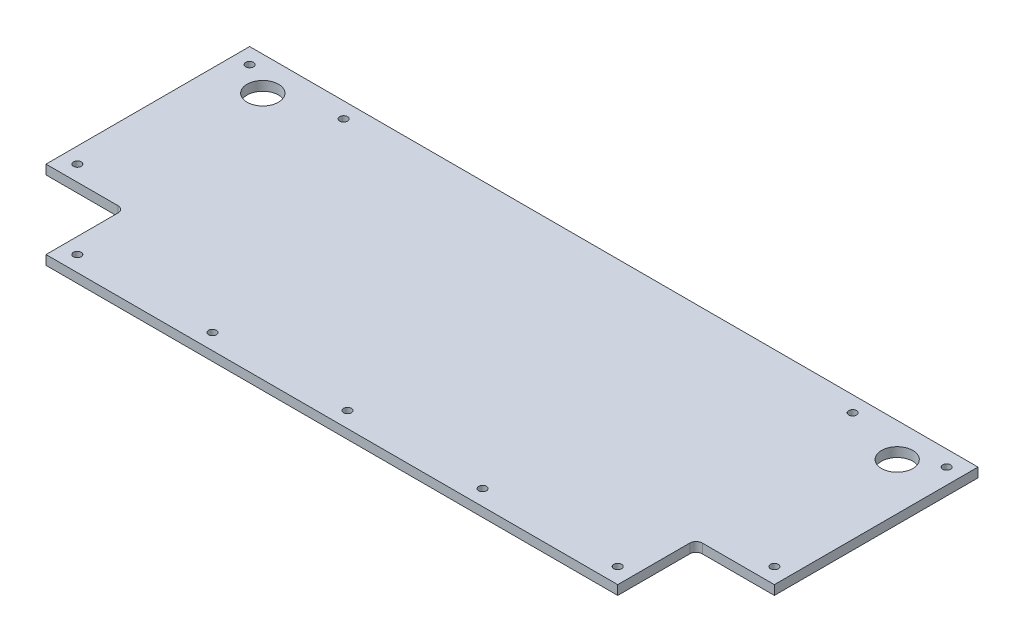
ISO-10303-21;
HEADER;
FILE_DESCRIPTION(('STEP AP214'),'2;1');
FILE_NAME('part.step','',(''),(''),'','','');
FILE_SCHEMA(('AUTOMOTIVE_DESIGN { 1 0 10303 214 1 1 1 1 }'));
ENDSEC;
DATA;
#1=APPLICATION_CONTEXT('core data for automotive mechanical design processes');
#2=APPLICATION_PROTOCOL_DEFINITION('international standard','automotive_design',2000,#1);
#3=PRODUCT_CONTEXT('',#1,'mechanical');
#4=PRODUCT('Part','Part','',(#3));
#5=PRODUCT_RELATED_PRODUCT_CATEGORY('part','',(#4));
#6=PRODUCT_DEFINITION_FORMATION('','',#4);
#7=PRODUCT_DEFINITION_CONTEXT('part definition',#1,'design');
#8=PRODUCT_DEFINITION('design','',#6,#7);
#9=PRODUCT_DEFINITION_SHAPE('','',#8);
#10=(LENGTH_UNIT() NAMED_UNIT(*) SI_UNIT(.MILLI.,.METRE.));
#11=(NAMED_UNIT(*) PLANE_ANGLE_UNIT() SI_UNIT($,.RADIAN.));
#12=(NAMED_UNIT(*) SI_UNIT($,.STERADIAN.) SOLID_ANGLE_UNIT());
#13=UNCERTAINTY_MEASURE_WITH_UNIT(LENGTH_MEASURE(1.E-05),#10,'distance_accuracy_value','');
#14=(GEOMETRIC_REPRESENTATION_CONTEXT(3) GLOBAL_UNCERTAINTY_ASSIGNED_CONTEXT((#13)) GLOBAL_UNIT_ASSIGNED_CONTEXT((#10,
#11,#12)) REPRESENTATION_CONTEXT('',''));
#15=CARTESIAN_POINT('',(0.,0.,0.));
#16=DIRECTION('',(0.,0.,1.));
#17=DIRECTION('',(1.,0.,0.));
#18=AXIS2_PLACEMENT_3D('',#15,#16,#17);
#19=CARTESIAN_POINT('',(182.5,6.,-50.));
#20=DIRECTION('',(-1.,0.,0.));
#21=DIRECTION('',(0.,0.,1.));
#22=AXIS2_PLACEMENT_3D('',#19,#20,#21);
#23=PLANE('',#22);
#24=DIRECTION('',(0.,0.,-1.));
#25=VECTOR('',#24,1.);
#26=CARTESIAN_POINT('',(182.5,0.,-50.));
#27=LINE('',#26,#25);
#28=CARTESIAN_POINT('',(182.5,0.,0.));
#29=VERTEX_POINT('',#28);
#30=CARTESIAN_POINT('',(182.5,0.,-46.));
#31=VERTEX_POINT('',#30);
#32=EDGE_CURVE('E198',#29,#31,#27,.T.);
#33=ORIENTED_EDGE('',*,*,#32,.T.);
#34=DIRECTION('',(0.,-1.,0.));
#35=VECTOR('',#34,1.);
#36=CARTESIAN_POINT('',(182.5,6.,-46.));
#37=LINE('',#36,#35);
#38=CARTESIAN_POINT('',(182.5,6.,-46.));
#39=VERTEX_POINT('',#38);
#40=EDGE_CURVE('E48',#31,#39,#37,.F.);
#41=ORIENTED_EDGE('',*,*,#40,.T.);
#42=DIRECTION('',(0.,0.,-1.));
#43=VECTOR('',#42,1.);
#44=CARTESIAN_POINT('',(182.5,6.,-50.));
#45=LINE('',#44,#43);
#46=CARTESIAN_POINT('',(182.5,6.,0.));
#47=VERTEX_POINT('',#46);
#48=EDGE_CURVE('E107',#47,#39,#45,.T.);
#49=ORIENTED_EDGE('',*,*,#48,.F.);
#50=DIRECTION('',(0.,-1.,0.));
#51=VECTOR('',#50,1.);
#52=CARTESIAN_POINT('',(182.5,6.,0.));
#53=LINE('',#52,#51);
#54=EDGE_CURVE('E110',#47,#29,#53,.T.);
#55=ORIENTED_EDGE('',*,*,#54,.T.);
#56=EDGE_LOOP('',(#33,#41,#49,#55));
#57=FACE_BOUND('',#56,.T.);
#58=ADVANCED_FACE('F33',(#57),#23,.F.);
#59=CARTESIAN_POINT('',(232.5,6.,-50.));
#60=DIRECTION('',(0.,0.,-1.));
#61=DIRECTION('',(-1.,0.,0.));
#62=AXIS2_PLACEMENT_3D('',#59,#60,#61);
#63=PLANE('',#62);
#64=DIRECTION('',(1.,0.,0.));
#65=VECTOR('',#64,1.);
#66=CARTESIAN_POINT('',(232.5,6.,-50.));
#67=LINE('',#66,#65);
#68=CARTESIAN_POINT('',(186.5,6.,-50.));
#69=VERTEX_POINT('',#68);
#70=CARTESIAN_POINT('',(232.5,6.,-50.));
#71=VERTEX_POINT('',#70);
#72=EDGE_CURVE('E113',#69,#71,#67,.T.);
#73=ORIENTED_EDGE('',*,*,#72,.F.);
#74=DIRECTION('',(0.,-1.,0.));
#75=VECTOR('',#74,1.);
#76=CARTESIAN_POINT('',(186.5,0.,-50.));
#77=LINE('',#76,#75);
#78=CARTESIAN_POINT('',(186.5,0.,-50.));
#79=VERTEX_POINT('',#78);
#80=EDGE_CURVE('E139',#69,#79,#77,.T.);
#81=ORIENTED_EDGE('',*,*,#80,.T.);
#82=DIRECTION('',(1.,0.,0.));
#83=VECTOR('',#82,1.);
#84=CARTESIAN_POINT('',(232.5,0.,-50.));
#85=LINE('',#84,#83);
#86=CARTESIAN_POINT('',(232.5,0.,-50.));
#87=VERTEX_POINT('',#86);
#88=EDGE_CURVE('E194',#79,#87,#85,.T.);
#89=ORIENTED_EDGE('',*,*,#88,.T.);
#90=DIRECTION('',(0.,-1.,0.));
#91=VECTOR('',#90,1.);
#92=CARTESIAN_POINT('',(232.5,6.,-50.));
#93=LINE('',#92,#91);
#94=EDGE_CURVE('E128',#71,#87,#93,.T.);
#95=ORIENTED_EDGE('',*,*,#94,.F.);
#96=EDGE_LOOP('',(#73,#81,#89,#95));
#97=FACE_BOUND('',#96,.T.);
#98=ADVANCED_FACE('F338',(#97),#63,.F.);
#99=CARTESIAN_POINT('',(232.5,6.,-180.));
#100=DIRECTION('',(-1.,0.,0.));
#101=DIRECTION('',(0.,0.,1.));
#102=AXIS2_PLACEMENT_3D('',#99,#100,#101);
#103=PLANE('',#102);
#104=DIRECTION('',(0.,0.,-1.));
#105=VECTOR('',#104,1.);
#106=CARTESIAN_POINT('',(232.5,0.,-180.));
#107=LINE('',#106,#105);
#108=CARTESIAN_POINT('',(232.5,0.,-180.));
#109=VERTEX_POINT('',#108);
#110=EDGE_CURVE('E193',#87,#109,#107,.T.);
#111=ORIENTED_EDGE('',*,*,#110,.T.);
#112=DIRECTION('',(0.,-1.,0.));
#113=VECTOR('',#112,1.);
#114=CARTESIAN_POINT('',(232.5,6.,-180.));
#115=LINE('',#114,#113);
#116=CARTESIAN_POINT('',(232.5,6.,-180.));
#117=VERTEX_POINT('',#116);
#118=EDGE_CURVE('E134',#117,#109,#115,.T.);
#119=ORIENTED_EDGE('',*,*,#118,.F.);
#120=DIRECTION('',(0.,0.,-1.));
#121=VECTOR('',#120,1.);
#122=CARTESIAN_POINT('',(232.5,6.,-180.));
#123=LINE('',#122,#121);
#124=EDGE_CURVE('E205',#71,#117,#123,.T.);
#125=ORIENTED_EDGE('',*,*,#124,.F.);
#126=ORIENTED_EDGE('',*,*,#94,.T.);
#127=EDGE_LOOP('',(#111,#119,#125,#126));
#128=FACE_BOUND('',#127,.T.);
#129=ADVANCED_FACE('F343',(#128),#103,.F.);
#130=CARTESIAN_POINT('',(-232.5,6.,-180.));
#131=DIRECTION('',(0.,0.,1.));
#132=DIRECTION('',(1.,0.,0.));
#133=AXIS2_PLACEMENT_3D('',#130,#131,#132);
#134=PLANE('',#133);
#135=DIRECTION('',(-1.,0.,0.));
#136=VECTOR('',#135,1.);
#137=CARTESIAN_POINT('',(-232.5,0.,-180.));
#138=LINE('',#137,#136);
#139=CARTESIAN_POINT('',(-232.5,0.,-180.));
#140=VERTEX_POINT('',#139);
#141=EDGE_CURVE('E173',#109,#140,#138,.T.);
#142=ORIENTED_EDGE('',*,*,#141,.T.);
#143=DIRECTION('',(0.,-1.,0.));
#144=VECTOR('',#143,1.);
#145=CARTESIAN_POINT('',(-232.5,6.,-180.));
#146=LINE('',#145,#144);
#147=CARTESIAN_POINT('',(-232.5,6.,-180.));
#148=VERTEX_POINT('',#147);
#149=EDGE_CURVE('E180',#148,#140,#146,.T.);
#150=ORIENTED_EDGE('',*,*,#149,.F.);
#151=DIRECTION('',(-1.,0.,0.));
#152=VECTOR('',#151,1.);
#153=CARTESIAN_POINT('',(-232.5,6.,-180.));
#154=LINE('',#153,#152);
#155=EDGE_CURVE('E189',#117,#148,#154,.T.);
#156=ORIENTED_EDGE('',*,*,#155,.F.);
#157=ORIENTED_EDGE('',*,*,#118,.T.);
#158=EDGE_LOOP('',(#142,#150,#156,#157));
#159=FACE_BOUND('',#158,.T.);
#160=ADVANCED_FACE('F187',(#159),#134,.F.);
#161=CARTESIAN_POINT('',(-232.5,6.,-50.));
#162=DIRECTION('',(1.,0.,0.));
#163=DIRECTION('',(0.,0.,-1.));
#164=AXIS2_PLACEMENT_3D('',#161,#162,#163);
#165=PLANE('',#164);
#166=DIRECTION('',(0.,0.,1.));
#167=VECTOR('',#166,1.);
#168=CARTESIAN_POINT('',(-232.5,0.,-50.));
#169=LINE('',#168,#167);
#170=CARTESIAN_POINT('',(-232.5,0.,-50.));
#171=VERTEX_POINT('',#170);
#172=EDGE_CURVE('E170',#140,#171,#169,.T.);
#173=ORIENTED_EDGE('',*,*,#172,.T.);
#174=DIRECTION('',(0.,-1.,0.));
#175=VECTOR('',#174,1.);
#176=CARTESIAN_POINT('',(-232.5,6.,-50.));
#177=LINE('',#176,#175);
#178=CARTESIAN_POINT('',(-232.5,6.,-50.));
#179=VERTEX_POINT('',#178);
#180=EDGE_CURVE('E169',#179,#171,#177,.T.);
#181=ORIENTED_EDGE('',*,*,#180,.F.);
#182=DIRECTION('',(0.,0.,1.));
#183=VECTOR('',#182,1.);
#184=CARTESIAN_POINT('',(-232.5,6.,-50.));
#185=LINE('',#184,#183);
#186=EDGE_CURVE('E202',#148,#179,#185,.T.);
#187=ORIENTED_EDGE('',*,*,#186,.F.);
#188=ORIENTED_EDGE('',*,*,#149,.T.);
#189=EDGE_LOOP('',(#173,#181,#187,#188));
#190=FACE_BOUND('',#189,.T.);
#191=ADVANCED_FACE('F457',(#190),#165,.F.);
#192=CARTESIAN_POINT('',(-182.5,6.,-50.));
#193=DIRECTION('',(0.,0.,-1.));
#194=DIRECTION('',(-1.,0.,0.));
#195=AXIS2_PLACEMENT_3D('',#192,#193,#194);
#196=PLANE('',#195);
#197=DIRECTION('',(1.,0.,0.));
#198=VECTOR('',#197,1.);
#199=CARTESIAN_POINT('',(-182.5,0.,-50.));
#200=LINE('',#199,#198);
#201=CARTESIAN_POINT('',(-186.5,0.,-50.));
#202=VERTEX_POINT('',#201);
#203=EDGE_CURVE('E163',#171,#202,#200,.T.);
#204=ORIENTED_EDGE('',*,*,#203,.T.);
#205=DIRECTION('',(0.,-1.,0.));
#206=VECTOR('',#205,1.);
#207=CARTESIAN_POINT('',(-186.5,6.,-50.));
#208=LINE('',#207,#206);
#209=CARTESIAN_POINT('',(-186.5,6.,-50.));
#210=VERTEX_POINT('',#209);
#211=EDGE_CURVE('E131',#202,#210,#208,.F.);
#212=ORIENTED_EDGE('',*,*,#211,.T.);
#213=DIRECTION('',(1.,0.,0.));
#214=VECTOR('',#213,1.);
#215=CARTESIAN_POINT('',(-182.5,6.,-50.));
#216=LINE('',#215,#214);
#217=EDGE_CURVE('E149',#179,#210,#216,.T.);
#218=ORIENTED_EDGE('',*,*,#217,.F.);
#219=ORIENTED_EDGE('',*,*,#180,.T.);
#220=EDGE_LOOP('',(#204,#212,#218,#219));
#221=FACE_BOUND('',#220,.T.);
#222=ADVANCED_FACE('F167',(#221),#196,.F.);
#223=CARTESIAN_POINT('',(-182.5,6.,0.));
#224=DIRECTION('',(1.,0.,0.));
#225=DIRECTION('',(0.,0.,-1.));
#226=AXIS2_PLACEMENT_3D('',#223,#224,#225);
#227=PLANE('',#226);
#228=DIRECTION('',(0.,0.,1.));
#229=VECTOR('',#228,1.);
#230=CARTESIAN_POINT('',(-182.5,6.,0.));
#231=LINE('',#230,#229);
#232=CARTESIAN_POINT('',(-182.5,6.,-46.));
#233=VERTEX_POINT('',#232);
#234=CARTESIAN_POINT('',(-182.5,6.,0.));
#235=VERTEX_POINT('',#234);
#236=EDGE_CURVE('E119',#233,#235,#231,.T.);
#237=ORIENTED_EDGE('',*,*,#236,.F.);
#238=DIRECTION('',(0.,-1.,0.));
#239=VECTOR('',#238,1.);
#240=CARTESIAN_POINT('',(-182.5,0.,-46.));
#241=LINE('',#240,#239);
#242=CARTESIAN_POINT('',(-182.5,0.,-46.));
#243=VERTEX_POINT('',#242);
#244=EDGE_CURVE('E127',#233,#243,#241,.T.);
#245=ORIENTED_EDGE('',*,*,#244,.T.);
#246=DIRECTION('',(0.,0.,1.));
#247=VECTOR('',#246,1.);
#248=CARTESIAN_POINT('',(-182.5,0.,0.));
#249=LINE('',#248,#247);
#250=CARTESIAN_POINT('',(-182.5,0.,0.));
#251=VERTEX_POINT('',#250);
#252=EDGE_CURVE('E164',#243,#251,#249,.T.);
#253=ORIENTED_EDGE('',*,*,#252,.T.);
#254=DIRECTION('',(0.,-1.,0.));
#255=VECTOR('',#254,1.);
#256=CARTESIAN_POINT('',(-182.5,6.,0.));
#257=LINE('',#256,#255);
#258=EDGE_CURVE('E156',#235,#251,#257,.T.);
#259=ORIENTED_EDGE('',*,*,#258,.F.);
#260=EDGE_LOOP('',(#237,#245,#253,#259));
#261=FACE_BOUND('',#260,.T.);
#262=ADVANCED_FACE('F154',(#261),#227,.F.);
#263=CARTESIAN_POINT('',(0.,6.,0.));
#264=DIRECTION('',(0.,0.,-1.));
#265=DIRECTION('',(-1.,0.,0.));
#266=AXIS2_PLACEMENT_3D('',#263,#264,#265);
#267=PLANE('',#266);
#268=DIRECTION('',(1.,0.,0.));
#269=VECTOR('',#268,1.);
#270=CARTESIAN_POINT('',(0.,0.,0.));
#271=LINE('',#270,#269);
#272=EDGE_CURVE('E123',#251,#29,#271,.T.);
#273=ORIENTED_EDGE('',*,*,#272,.T.);
#274=ORIENTED_EDGE('',*,*,#54,.F.);
#275=DIRECTION('',(1.,0.,0.));
#276=VECTOR('',#275,1.);
#277=CARTESIAN_POINT('',(182.5,6.,0.));
#278=LINE('',#277,#276);
#279=EDGE_CURVE('E114',#235,#47,#278,.T.);
#280=ORIENTED_EDGE('',*,*,#279,.F.);
#281=ORIENTED_EDGE('',*,*,#258,.T.);
#282=EDGE_LOOP('',(#273,#274,#280,#281));
#283=FACE_BOUND('',#282,.T.);
#284=ADVANCED_FACE('F125',(#283),#267,.F.);
#285=CARTESIAN_POINT('',(0.,6.,0.));
#286=DIRECTION('',(0.,-1.,0.));
#287=DIRECTION('',(0.,0.,-1.));
#288=AXIS2_PLACEMENT_3D('',#285,#286,#287);
#289=PLANE('',#288);
#290=CARTESIAN_POINT('',(202.5,6.,-158.4));
#291=DIRECTION('',(0.,1.,0.));
#292=DIRECTION('',(0.,0.,1.));
#293=AXIS2_PLACEMENT_3D('',#290,#291,#292);
#294=CIRCLE('',#293,10.);
#295=CARTESIAN_POINT('',(202.5,6.,-148.4));
#296=VERTEX_POINT('',#295);
#297=EDGE_CURVE('E280',#296,#296,#294,.T.);
#298=ORIENTED_EDGE('',*,*,#297,.F.);
#299=EDGE_LOOP('',(#298));
#300=FACE_BOUND('',#299,.T.);
#301=CARTESIAN_POINT('',(-202.5,6.,-158.4));
#302=DIRECTION('',(0.,1.,0.));
#303=DIRECTION('',(0.,0.,1.));
#304=AXIS2_PLACEMENT_3D('',#301,#302,#303);
#305=CIRCLE('',#304,10.);
#306=CARTESIAN_POINT('',(-202.5,6.,-148.4));
#307=VERTEX_POINT('',#306);
#308=EDGE_CURVE('E274',#307,#307,#305,.T.);
#309=ORIENTED_EDGE('',*,*,#308,.F.);
#310=EDGE_LOOP('',(#309));
#311=FACE_BOUND('',#310,.T.);
#312=CARTESIAN_POINT('',(162.5,6.,-170.));
#313=DIRECTION('',(0.,1.,0.));
#314=DIRECTION('',(0.,0.,1.));
#315=AXIS2_PLACEMENT_3D('',#312,#313,#314);
#316=CIRCLE('',#315,2.5);
#317=CARTESIAN_POINT('',(162.5,6.,-167.5));
#318=VERTEX_POINT('',#317);
#319=EDGE_CURVE('E268',#318,#318,#316,.T.);
#320=ORIENTED_EDGE('',*,*,#319,.F.);
#321=EDGE_LOOP('',(#320));
#322=FACE_BOUND('',#321,.T.);
#323=CARTESIAN_POINT('',(-162.5,6.,-170.));
#324=DIRECTION('',(0.,1.,0.));
#325=DIRECTION('',(0.,0.,1.));
#326=AXIS2_PLACEMENT_3D('',#323,#324,#325);
#327=CIRCLE('',#326,2.5);
#328=CARTESIAN_POINT('',(-162.5,6.,-167.5));
#329=VERTEX_POINT('',#328);
#330=EDGE_CURVE('E262',#329,#329,#327,.T.);
#331=ORIENTED_EDGE('',*,*,#330,.F.);
#332=EDGE_LOOP('',(#331));
#333=FACE_BOUND('',#332,.T.);
#334=CARTESIAN_POINT('',(172.5,6.,-9.99999999999998));
#335=DIRECTION('',(0.,1.,0.));
#336=DIRECTION('',(0.,0.,1.));
#337=AXIS2_PLACEMENT_3D('',#334,#335,#336);
#338=CIRCLE('',#337,2.5);
#339=CARTESIAN_POINT('',(172.5,6.,-7.49999999999998));
#340=VERTEX_POINT('',#339);
#341=EDGE_CURVE('E256',#340,#340,#338,.T.);
#342=ORIENTED_EDGE('',*,*,#341,.F.);
#343=EDGE_LOOP('',(#342));
#344=FACE_BOUND('',#343,.T.);
#345=CARTESIAN_POINT('',(86.25,6.,-9.99999999999998));
#346=DIRECTION('',(0.,1.,0.));
#347=DIRECTION('',(0.,0.,1.));
#348=AXIS2_PLACEMENT_3D('',#345,#346,#347);
#349=CIRCLE('',#348,2.49999999999999);
#350=CARTESIAN_POINT('',(86.25,6.,-7.49999999999998));
#351=VERTEX_POINT('',#350);
#352=EDGE_CURVE('E250',#351,#351,#349,.T.);
#353=ORIENTED_EDGE('',*,*,#352,.F.);
#354=EDGE_LOOP('',(#353));
#355=FACE_BOUND('',#354,.T.);
#356=CARTESIAN_POINT('',(0.,6.,-9.99999999999998));
#357=DIRECTION('',(0.,1.,0.));
#358=DIRECTION('',(0.,0.,1.));
#359=AXIS2_PLACEMENT_3D('',#356,#357,#358);
#360=CIRCLE('',#359,2.5);
#361=CARTESIAN_POINT('',(0.,6.,-7.49999999999998));
#362=VERTEX_POINT('',#361);
#363=EDGE_CURVE('E244',#362,#362,#360,.T.);
#364=ORIENTED_EDGE('',*,*,#363,.F.);
#365=EDGE_LOOP('',(#364));
#366=FACE_BOUND('',#365,.T.);
#367=CARTESIAN_POINT('',(-86.25,6.,-9.99999999999998));
#368=DIRECTION('',(0.,1.,0.));
#369=DIRECTION('',(0.,0.,1.));
#370=AXIS2_PLACEMENT_3D('',#367,#368,#369);
#371=CIRCLE('',#370,2.49999999999999);
#372=CARTESIAN_POINT('',(-86.25,6.,-7.49999999999998));
#373=VERTEX_POINT('',#372);
#374=EDGE_CURVE('E238',#373,#373,#371,.T.);
#375=ORIENTED_EDGE('',*,*,#374,.F.);
#376=EDGE_LOOP('',(#375));
#377=FACE_BOUND('',#376,.T.);
#378=CARTESIAN_POINT('',(-172.5,6.,-9.99999999999998));
#379=DIRECTION('',(0.,1.,0.));
#380=DIRECTION('',(0.,0.,1.));
#381=AXIS2_PLACEMENT_3D('',#378,#379,#380);
#382=CIRCLE('',#381,2.5);
#383=CARTESIAN_POINT('',(-172.5,6.,-7.49999999999998));
#384=VERTEX_POINT('',#383);
#385=EDGE_CURVE('E232',#384,#384,#382,.T.);
#386=ORIENTED_EDGE('',*,*,#385,.F.);
#387=EDGE_LOOP('',(#386));
#388=FACE_BOUND('',#387,.T.);
#389=CARTESIAN_POINT('',(222.5,6.,-60.));
#390=DIRECTION('',(0.,1.,0.));
#391=DIRECTION('',(0.,0.,1.));
#392=AXIS2_PLACEMENT_3D('',#389,#390,#391);
#393=CIRCLE('',#392,2.5);
#394=CARTESIAN_POINT('',(222.5,6.,-57.5));
#395=VERTEX_POINT('',#394);
#396=EDGE_CURVE('E226',#395,#395,#393,.T.);
#397=ORIENTED_EDGE('',*,*,#396,.F.);
#398=EDGE_LOOP('',(#397));
#399=FACE_BOUND('',#398,.T.);
#400=CARTESIAN_POINT('',(222.5,6.,-170.));
#401=DIRECTION('',(0.,1.,0.));
#402=DIRECTION('',(0.,0.,1.));
#403=AXIS2_PLACEMENT_3D('',#400,#401,#402);
#404=CIRCLE('',#403,2.5);
#405=CARTESIAN_POINT('',(222.5,6.,-167.5));
#406=VERTEX_POINT('',#405);
#407=EDGE_CURVE('E220',#406,#406,#404,.T.);
#408=ORIENTED_EDGE('',*,*,#407,.F.);
#409=EDGE_LOOP('',(#408));
#410=FACE_BOUND('',#409,.T.);
#411=CARTESIAN_POINT('',(-222.5,6.,-60.));
#412=DIRECTION('',(0.,1.,0.));
#413=DIRECTION('',(0.,0.,1.));
#414=AXIS2_PLACEMENT_3D('',#411,#412,#413);
#415=CIRCLE('',#414,2.5);
#416=CARTESIAN_POINT('',(-222.5,6.,-57.5));
#417=VERTEX_POINT('',#416);
#418=EDGE_CURVE('E214',#417,#417,#415,.T.);
#419=ORIENTED_EDGE('',*,*,#418,.F.);
#420=EDGE_LOOP('',(#419));
#421=FACE_BOUND('',#420,.T.);
#422=CARTESIAN_POINT('',(-222.5,6.,-170.));
#423=DIRECTION('',(0.,1.,0.));
#424=DIRECTION('',(0.,0.,1.));
#425=AXIS2_PLACEMENT_3D('',#422,#423,#424);
#426=CIRCLE('',#425,2.5);
#427=CARTESIAN_POINT('',(-222.5,6.,-167.5));
#428=VERTEX_POINT('',#427);
#429=EDGE_CURVE('E208',#428,#428,#426,.T.);
#430=ORIENTED_EDGE('',*,*,#429,.F.);
#431=EDGE_LOOP('',(#430));
#432=FACE_BOUND('',#431,.T.);
#433=ORIENTED_EDGE('',*,*,#279,.T.);
#434=ORIENTED_EDGE('',*,*,#48,.T.);
#435=CARTESIAN_POINT('',(186.5,6.,-46.));
#436=DIRECTION('',(0.,-1.,0.));
#437=DIRECTION('',(0.,0.,-1.));
#438=AXIS2_PLACEMENT_3D('',#435,#436,#437);
#439=CIRCLE('',#438,4.);
#440=EDGE_CURVE('E11',#39,#69,#439,.T.);
#441=ORIENTED_EDGE('',*,*,#440,.T.);
#442=ORIENTED_EDGE('',*,*,#72,.T.);
#443=ORIENTED_EDGE('',*,*,#124,.T.);
#444=ORIENTED_EDGE('',*,*,#155,.T.);
#445=ORIENTED_EDGE('',*,*,#186,.T.);
#446=ORIENTED_EDGE('',*,*,#217,.T.);
#447=CARTESIAN_POINT('',(-186.5,6.,-46.));
#448=DIRECTION('',(0.,-1.,0.));
#449=DIRECTION('',(0.,0.,-1.));
#450=AXIS2_PLACEMENT_3D('',#447,#448,#449);
#451=CIRCLE('',#450,4.);
#452=EDGE_CURVE('E145',#210,#233,#451,.T.);
#453=ORIENTED_EDGE('',*,*,#452,.T.);
#454=ORIENTED_EDGE('',*,*,#236,.T.);
#455=EDGE_LOOP('',(#433,#434,#441,#442,#443,#444,#445,#446,#453,#454));
#456=FACE_BOUND('',#455,.T.);
#457=ADVANCED_FACE('F117',(#300,#311,#322,#333,#344,#355,#366,#377,#388,#399,#410,#421,#432,
#456),#289,.F.);
#458=CARTESIAN_POINT('',(0.,0.,0.));
#459=DIRECTION('',(0.,-1.,0.));
#460=DIRECTION('',(0.,0.,-1.));
#461=AXIS2_PLACEMENT_3D('',#458,#459,#460);
#462=PLANE('',#461);
#463=CARTESIAN_POINT('',(202.5,0.,-158.4));
#464=DIRECTION('',(0.,1.,0.));
#465=DIRECTION('',(0.,0.,1.));
#466=AXIS2_PLACEMENT_3D('',#463,#464,#465);
#467=CIRCLE('',#466,10.);
#468=CARTESIAN_POINT('',(202.5,0.,-148.4));
#469=VERTEX_POINT('',#468);
#470=EDGE_CURVE('E277',#469,#469,#467,.T.);
#471=ORIENTED_EDGE('',*,*,#470,.T.);
#472=EDGE_LOOP('',(#471));
#473=FACE_BOUND('',#472,.T.);
#474=CARTESIAN_POINT('',(-202.5,0.,-158.4));
#475=DIRECTION('',(0.,1.,0.));
#476=DIRECTION('',(0.,0.,1.));
#477=AXIS2_PLACEMENT_3D('',#474,#475,#476);
#478=CIRCLE('',#477,10.);
#479=CARTESIAN_POINT('',(-202.5,0.,-148.4));
#480=VERTEX_POINT('',#479);
#481=EDGE_CURVE('E271',#480,#480,#478,.T.);
#482=ORIENTED_EDGE('',*,*,#481,.T.);
#483=EDGE_LOOP('',(#482));
#484=FACE_BOUND('',#483,.T.);
#485=CARTESIAN_POINT('',(162.5,0.,-170.));
#486=DIRECTION('',(0.,1.,0.));
#487=DIRECTION('',(0.,0.,1.));
#488=AXIS2_PLACEMENT_3D('',#485,#486,#487);
#489=CIRCLE('',#488,2.5);
#490=CARTESIAN_POINT('',(162.5,0.,-167.5));
#491=VERTEX_POINT('',#490);
#492=EDGE_CURVE('E265',#491,#491,#489,.T.);
#493=ORIENTED_EDGE('',*,*,#492,.T.);
#494=EDGE_LOOP('',(#493));
#495=FACE_BOUND('',#494,.T.);
#496=CARTESIAN_POINT('',(-162.5,0.,-170.));
#497=DIRECTION('',(0.,1.,0.));
#498=DIRECTION('',(0.,0.,1.));
#499=AXIS2_PLACEMENT_3D('',#496,#497,#498);
#500=CIRCLE('',#499,2.5);
#501=CARTESIAN_POINT('',(-162.5,0.,-167.5));
#502=VERTEX_POINT('',#501);
#503=EDGE_CURVE('E259',#502,#502,#500,.T.);
#504=ORIENTED_EDGE('',*,*,#503,.T.);
#505=EDGE_LOOP('',(#504));
#506=FACE_BOUND('',#505,.T.);
#507=CARTESIAN_POINT('',(172.5,0.,-9.99999999999998));
#508=DIRECTION('',(0.,1.,0.));
#509=DIRECTION('',(0.,0.,1.));
#510=AXIS2_PLACEMENT_3D('',#507,#508,#509);
#511=CIRCLE('',#510,2.5);
#512=CARTESIAN_POINT('',(172.5,0.,-7.49999999999998));
#513=VERTEX_POINT('',#512);
#514=EDGE_CURVE('E253',#513,#513,#511,.T.);
#515=ORIENTED_EDGE('',*,*,#514,.T.);
#516=EDGE_LOOP('',(#515));
#517=FACE_BOUND('',#516,.T.);
#518=CARTESIAN_POINT('',(86.25,0.,-9.99999999999998));
#519=DIRECTION('',(0.,1.,0.));
#520=DIRECTION('',(0.,0.,1.));
#521=AXIS2_PLACEMENT_3D('',#518,#519,#520);
#522=CIRCLE('',#521,2.49999999999999);
#523=CARTESIAN_POINT('',(86.25,0.,-7.49999999999998));
#524=VERTEX_POINT('',#523);
#525=EDGE_CURVE('E247',#524,#524,#522,.T.);
#526=ORIENTED_EDGE('',*,*,#525,.T.);
#527=EDGE_LOOP('',(#526));
#528=FACE_BOUND('',#527,.T.);
#529=CARTESIAN_POINT('',(0.,0.,-9.99999999999998));
#530=DIRECTION('',(0.,1.,0.));
#531=DIRECTION('',(0.,0.,1.));
#532=AXIS2_PLACEMENT_3D('',#529,#530,#531);
#533=CIRCLE('',#532,2.5);
#534=CARTESIAN_POINT('',(0.,0.,-7.49999999999998));
#535=VERTEX_POINT('',#534);
#536=EDGE_CURVE('E241',#535,#535,#533,.T.);
#537=ORIENTED_EDGE('',*,*,#536,.T.);
#538=EDGE_LOOP('',(#537));
#539=FACE_BOUND('',#538,.T.);
#540=CARTESIAN_POINT('',(-86.25,0.,-9.99999999999998));
#541=DIRECTION('',(0.,1.,0.));
#542=DIRECTION('',(0.,0.,1.));
#543=AXIS2_PLACEMENT_3D('',#540,#541,#542);
#544=CIRCLE('',#543,2.49999999999999);
#545=CARTESIAN_POINT('',(-86.25,0.,-7.49999999999998));
#546=VERTEX_POINT('',#545);
#547=EDGE_CURVE('E235',#546,#546,#544,.T.);
#548=ORIENTED_EDGE('',*,*,#547,.T.);
#549=EDGE_LOOP('',(#548));
#550=FACE_BOUND('',#549,.T.);
#551=CARTESIAN_POINT('',(-172.5,0.,-9.99999999999998));
#552=DIRECTION('',(0.,1.,0.));
#553=DIRECTION('',(0.,0.,1.));
#554=AXIS2_PLACEMENT_3D('',#551,#552,#553);
#555=CIRCLE('',#554,2.5);
#556=CARTESIAN_POINT('',(-172.5,0.,-7.49999999999998));
#557=VERTEX_POINT('',#556);
#558=EDGE_CURVE('E229',#557,#557,#555,.T.);
#559=ORIENTED_EDGE('',*,*,#558,.T.);
#560=EDGE_LOOP('',(#559));
#561=FACE_BOUND('',#560,.T.);
#562=CARTESIAN_POINT('',(222.5,0.,-60.));
#563=DIRECTION('',(0.,1.,0.));
#564=DIRECTION('',(0.,0.,1.));
#565=AXIS2_PLACEMENT_3D('',#562,#563,#564);
#566=CIRCLE('',#565,2.5);
#567=CARTESIAN_POINT('',(222.5,0.,-57.5));
#568=VERTEX_POINT('',#567);
#569=EDGE_CURVE('E223',#568,#568,#566,.T.);
#570=ORIENTED_EDGE('',*,*,#569,.T.);
#571=EDGE_LOOP('',(#570));
#572=FACE_BOUND('',#571,.T.);
#573=CARTESIAN_POINT('',(222.5,0.,-170.));
#574=DIRECTION('',(0.,1.,0.));
#575=DIRECTION('',(0.,0.,1.));
#576=AXIS2_PLACEMENT_3D('',#573,#574,#575);
#577=CIRCLE('',#576,2.5);
#578=CARTESIAN_POINT('',(222.5,0.,-167.5));
#579=VERTEX_POINT('',#578);
#580=EDGE_CURVE('E217',#579,#579,#577,.T.);
#581=ORIENTED_EDGE('',*,*,#580,.T.);
#582=EDGE_LOOP('',(#581));
#583=FACE_BOUND('',#582,.T.);
#584=CARTESIAN_POINT('',(-222.5,0.,-60.));
#585=DIRECTION('',(0.,1.,0.));
#586=DIRECTION('',(0.,0.,1.));
#587=AXIS2_PLACEMENT_3D('',#584,#585,#586);
#588=CIRCLE('',#587,2.5);
#589=CARTESIAN_POINT('',(-222.5,0.,-57.5));
#590=VERTEX_POINT('',#589);
#591=EDGE_CURVE('E211',#590,#590,#588,.T.);
#592=ORIENTED_EDGE('',*,*,#591,.T.);
#593=EDGE_LOOP('',(#592));
#594=FACE_BOUND('',#593,.T.);
#595=CARTESIAN_POINT('',(-222.5,0.,-170.));
#596=DIRECTION('',(0.,1.,0.));
#597=DIRECTION('',(0.,0.,1.));
#598=AXIS2_PLACEMENT_3D('',#595,#596,#597);
#599=CIRCLE('',#598,2.5);
#600=CARTESIAN_POINT('',(-222.5,0.,-167.5));
#601=VERTEX_POINT('',#600);
#602=EDGE_CURVE('E199',#601,#601,#599,.T.);
#603=ORIENTED_EDGE('',*,*,#602,.T.);
#604=EDGE_LOOP('',(#603));
#605=FACE_BOUND('',#604,.T.);
#606=ORIENTED_EDGE('',*,*,#32,.F.);
#607=ORIENTED_EDGE('',*,*,#272,.F.);
#608=ORIENTED_EDGE('',*,*,#252,.F.);
#609=CARTESIAN_POINT('',(-186.5,0.,-46.));
#610=DIRECTION('',(0.,-1.,0.));
#611=DIRECTION('',(0.,0.,-1.));
#612=AXIS2_PLACEMENT_3D('',#609,#610,#611);
#613=CIRCLE('',#612,4.);
#614=EDGE_CURVE('E143',#243,#202,#613,.F.);
#615=ORIENTED_EDGE('',*,*,#614,.T.);
#616=ORIENTED_EDGE('',*,*,#203,.F.);
#617=ORIENTED_EDGE('',*,*,#172,.F.);
#618=ORIENTED_EDGE('',*,*,#141,.F.);
#619=ORIENTED_EDGE('',*,*,#110,.F.);
#620=ORIENTED_EDGE('',*,*,#88,.F.);
#621=CARTESIAN_POINT('',(186.5,0.,-46.));
#622=DIRECTION('',(0.,-1.,0.));
#623=DIRECTION('',(0.,0.,-1.));
#624=AXIS2_PLACEMENT_3D('',#621,#622,#623);
#625=CIRCLE('',#624,4.);
#626=EDGE_CURVE('E41',#79,#31,#625,.F.);
#627=ORIENTED_EDGE('',*,*,#626,.T.);
#628=EDGE_LOOP('',(#606,#607,#608,#615,#616,#617,#618,#619,#620,#627));
#629=FACE_BOUND('',#628,.T.);
#630=ADVANCED_FACE('F161',(#473,#484,#495,#506,#517,#528,#539,#550,#561,#572,#583,#594,#605,
#629),#462,.T.);
#631=CARTESIAN_POINT('',(-222.5,0.,-170.));
#632=DIRECTION('',(0.,1.,0.));
#633=DIRECTION('',(0.,0.,1.));
#634=AXIS2_PLACEMENT_3D('',#631,#632,#633);
#635=CYLINDRICAL_SURFACE('',#634,2.5);
#636=ORIENTED_EDGE('',*,*,#602,.F.);
#637=EDGE_LOOP('',(#636));
#638=FACE_BOUND('',#637,.T.);
#639=ORIENTED_EDGE('',*,*,#429,.T.);
#640=EDGE_LOOP('',(#639));
#641=FACE_BOUND('',#640,.T.);
#642=ADVANCED_FACE('F322',(#638,#641),#635,.F.);
#643=CARTESIAN_POINT('',(-222.5,0.,-60.));
#644=DIRECTION('',(0.,1.,0.));
#645=DIRECTION('',(0.,0.,1.));
#646=AXIS2_PLACEMENT_3D('',#643,#644,#645);
#647=CYLINDRICAL_SURFACE('',#646,2.5);
#648=ORIENTED_EDGE('',*,*,#591,.F.);
#649=EDGE_LOOP('',(#648));
#650=FACE_BOUND('',#649,.T.);
#651=ORIENTED_EDGE('',*,*,#418,.T.);
#652=EDGE_LOOP('',(#651));
#653=FACE_BOUND('',#652,.T.);
#654=ADVANCED_FACE('F324',(#650,#653),#647,.F.);
#655=CARTESIAN_POINT('',(222.5,0.,-170.));
#656=DIRECTION('',(0.,1.,0.));
#657=DIRECTION('',(0.,0.,1.));
#658=AXIS2_PLACEMENT_3D('',#655,#656,#657);
#659=CYLINDRICAL_SURFACE('',#658,2.5);
#660=ORIENTED_EDGE('',*,*,#580,.F.);
#661=EDGE_LOOP('',(#660));
#662=FACE_BOUND('',#661,.T.);
#663=ORIENTED_EDGE('',*,*,#407,.T.);
#664=EDGE_LOOP('',(#663));
#665=FACE_BOUND('',#664,.T.);
#666=ADVANCED_FACE('F331',(#662,#665),#659,.F.);
#667=CARTESIAN_POINT('',(222.5,0.,-60.));
#668=DIRECTION('',(0.,1.,0.));
#669=DIRECTION('',(0.,0.,1.));
#670=AXIS2_PLACEMENT_3D('',#667,#668,#669);
#671=CYLINDRICAL_SURFACE('',#670,2.5);
#672=ORIENTED_EDGE('',*,*,#569,.F.);
#673=EDGE_LOOP('',(#672));
#674=FACE_BOUND('',#673,.T.);
#675=ORIENTED_EDGE('',*,*,#396,.T.);
#676=EDGE_LOOP('',(#675));
#677=FACE_BOUND('',#676,.T.);
#678=ADVANCED_FACE('F385',(#674,#677),#671,.F.);
#679=CARTESIAN_POINT('',(-172.5,0.,-9.99999999999998));
#680=DIRECTION('',(0.,1.,0.));
#681=DIRECTION('',(0.,0.,1.));
#682=AXIS2_PLACEMENT_3D('',#679,#680,#681);
#683=CYLINDRICAL_SURFACE('',#682,2.5);
#684=ORIENTED_EDGE('',*,*,#558,.F.);
#685=EDGE_LOOP('',(#684));
#686=FACE_BOUND('',#685,.T.);
#687=ORIENTED_EDGE('',*,*,#385,.T.);
#688=EDGE_LOOP('',(#687));
#689=FACE_BOUND('',#688,.T.);
#690=ADVANCED_FACE('F381',(#686,#689),#683,.F.);
#691=CARTESIAN_POINT('',(-86.25,0.,-9.99999999999998));
#692=DIRECTION('',(0.,1.,0.));
#693=DIRECTION('',(0.,0.,1.));
#694=AXIS2_PLACEMENT_3D('',#691,#692,#693);
#695=CYLINDRICAL_SURFACE('',#694,2.49999999999999);
#696=ORIENTED_EDGE('',*,*,#547,.F.);
#697=EDGE_LOOP('',(#696));
#698=FACE_BOUND('',#697,.T.);
#699=ORIENTED_EDGE('',*,*,#374,.T.);
#700=EDGE_LOOP('',(#699));
#701=FACE_BOUND('',#700,.T.);
#702=ADVANCED_FACE('F377',(#698,#701),#695,.F.);
#703=CARTESIAN_POINT('',(0.,0.,-9.99999999999998));
#704=DIRECTION('',(0.,1.,0.));
#705=DIRECTION('',(0.,0.,1.));
#706=AXIS2_PLACEMENT_3D('',#703,#704,#705);
#707=CYLINDRICAL_SURFACE('',#706,2.5);
#708=ORIENTED_EDGE('',*,*,#536,.F.);
#709=EDGE_LOOP('',(#708));
#710=FACE_BOUND('',#709,.T.);
#711=ORIENTED_EDGE('',*,*,#363,.T.);
#712=EDGE_LOOP('',(#711));
#713=FACE_BOUND('',#712,.T.);
#714=ADVANCED_FACE('F373',(#710,#713),#707,.F.);
#715=CARTESIAN_POINT('',(86.25,0.,-9.99999999999998));
#716=DIRECTION('',(0.,1.,0.));
#717=DIRECTION('',(0.,0.,1.));
#718=AXIS2_PLACEMENT_3D('',#715,#716,#717);
#719=CYLINDRICAL_SURFACE('',#718,2.49999999999999);
#720=ORIENTED_EDGE('',*,*,#525,.F.);
#721=EDGE_LOOP('',(#720));
#722=FACE_BOUND('',#721,.T.);
#723=ORIENTED_EDGE('',*,*,#352,.T.);
#724=EDGE_LOOP('',(#723));
#725=FACE_BOUND('',#724,.T.);
#726=ADVANCED_FACE('F369',(#722,#725),#719,.F.);
#727=CARTESIAN_POINT('',(172.5,0.,-9.99999999999998));
#728=DIRECTION('',(0.,1.,0.));
#729=DIRECTION('',(0.,0.,1.));
#730=AXIS2_PLACEMENT_3D('',#727,#728,#729);
#731=CYLINDRICAL_SURFACE('',#730,2.5);
#732=ORIENTED_EDGE('',*,*,#514,.F.);
#733=EDGE_LOOP('',(#732));
#734=FACE_BOUND('',#733,.T.);
#735=ORIENTED_EDGE('',*,*,#341,.T.);
#736=EDGE_LOOP('',(#735));
#737=FACE_BOUND('',#736,.T.);
#738=ADVANCED_FACE('F360',(#734,#737),#731,.F.);
#739=CARTESIAN_POINT('',(-162.5,0.,-170.));
#740=DIRECTION('',(0.,1.,0.));
#741=DIRECTION('',(0.,0.,1.));
#742=AXIS2_PLACEMENT_3D('',#739,#740,#741);
#743=CYLINDRICAL_SURFACE('',#742,2.5);
#744=ORIENTED_EDGE('',*,*,#503,.F.);
#745=EDGE_LOOP('',(#744));
#746=FACE_BOUND('',#745,.T.);
#747=ORIENTED_EDGE('',*,*,#330,.T.);
#748=EDGE_LOOP('',(#747));
#749=FACE_BOUND('',#748,.T.);
#750=ADVANCED_FACE('F354',(#746,#749),#743,.F.);
#751=CARTESIAN_POINT('',(162.5,0.,-170.));
#752=DIRECTION('',(0.,1.,0.));
#753=DIRECTION('',(0.,0.,1.));
#754=AXIS2_PLACEMENT_3D('',#751,#752,#753);
#755=CYLINDRICAL_SURFACE('',#754,2.5);
#756=ORIENTED_EDGE('',*,*,#492,.F.);
#757=EDGE_LOOP('',(#756));
#758=FACE_BOUND('',#757,.T.);
#759=ORIENTED_EDGE('',*,*,#319,.T.);
#760=EDGE_LOOP('',(#759));
#761=FACE_BOUND('',#760,.T.);
#762=ADVANCED_FACE('F348',(#758,#761),#755,.F.);
#763=CARTESIAN_POINT('',(-186.5,6.,-46.));
#764=DIRECTION('',(0.,1.,0.));
#765=DIRECTION('',(0.,0.,1.));
#766=AXIS2_PLACEMENT_3D('',#763,#764,#765);
#767=CYLINDRICAL_SURFACE('',#766,4.);
#768=ORIENTED_EDGE('',*,*,#452,.F.);
#769=ORIENTED_EDGE('',*,*,#211,.F.);
#770=ORIENTED_EDGE('',*,*,#614,.F.);
#771=ORIENTED_EDGE('',*,*,#244,.F.);
#772=EDGE_LOOP('',(#768,#769,#770,#771));
#773=FACE_BOUND('',#772,.T.);
#774=ADVANCED_FACE('F158',(#773),#767,.F.);
#775=CARTESIAN_POINT('',(186.5,6.,-46.));
#776=DIRECTION('',(0.,1.,0.));
#777=DIRECTION('',(0.,0.,1.));
#778=AXIS2_PLACEMENT_3D('',#775,#776,#777);
#779=CYLINDRICAL_SURFACE('',#778,4.);
#780=ORIENTED_EDGE('',*,*,#440,.F.);
#781=ORIENTED_EDGE('',*,*,#40,.F.);
#782=ORIENTED_EDGE('',*,*,#626,.F.);
#783=ORIENTED_EDGE('',*,*,#80,.F.);
#784=EDGE_LOOP('',(#780,#781,#782,#783));
#785=FACE_BOUND('',#784,.T.);
#786=ADVANCED_FACE('F35',(#785),#779,.F.);
#787=CARTESIAN_POINT('',(-202.5,0.,-158.4));
#788=DIRECTION('',(0.,1.,0.));
#789=DIRECTION('',(0.,0.,1.));
#790=AXIS2_PLACEMENT_3D('',#787,#788,#789);
#791=CYLINDRICAL_SURFACE('',#790,10.);
#792=ORIENTED_EDGE('',*,*,#481,.F.);
#793=EDGE_LOOP('',(#792));
#794=FACE_BOUND('',#793,.T.);
#795=ORIENTED_EDGE('',*,*,#308,.T.);
#796=EDGE_LOOP('',(#795));
#797=FACE_BOUND('',#796,.T.);
#798=ADVANCED_FACE('F291',(#794,#797),#791,.F.);
#799=CARTESIAN_POINT('',(202.5,0.,-158.4));
#800=DIRECTION('',(0.,1.,0.));
#801=DIRECTION('',(0.,0.,1.));
#802=AXIS2_PLACEMENT_3D('',#799,#800,#801);
#803=CYLINDRICAL_SURFACE('',#802,10.);
#804=ORIENTED_EDGE('',*,*,#470,.F.);
#805=EDGE_LOOP('',(#804));
#806=FACE_BOUND('',#805,.T.);
#807=ORIENTED_EDGE('',*,*,#297,.T.);
#808=EDGE_LOOP('',(#807));
#809=FACE_BOUND('',#808,.T.);
#810=ADVANCED_FACE('F288',(#806,#809),#803,.F.);
#811=CLOSED_SHELL('',(#58,#98,#129,#160,#191,#222,#262,#284,#457,#630,#642,#654,#666,#678,#690,
#702,#714,#726,#738,#750,#762,#774,#786,#798,#810));
#812=MANIFOLD_SOLID_BREP('B2',#811);
#813=ADVANCED_BREP_SHAPE_REPRESENTATION('',(#18,#812),#14);
#814=SHAPE_DEFINITION_REPRESENTATION(#9,#813);
ENDSEC;
END-ISO-10303-21;
